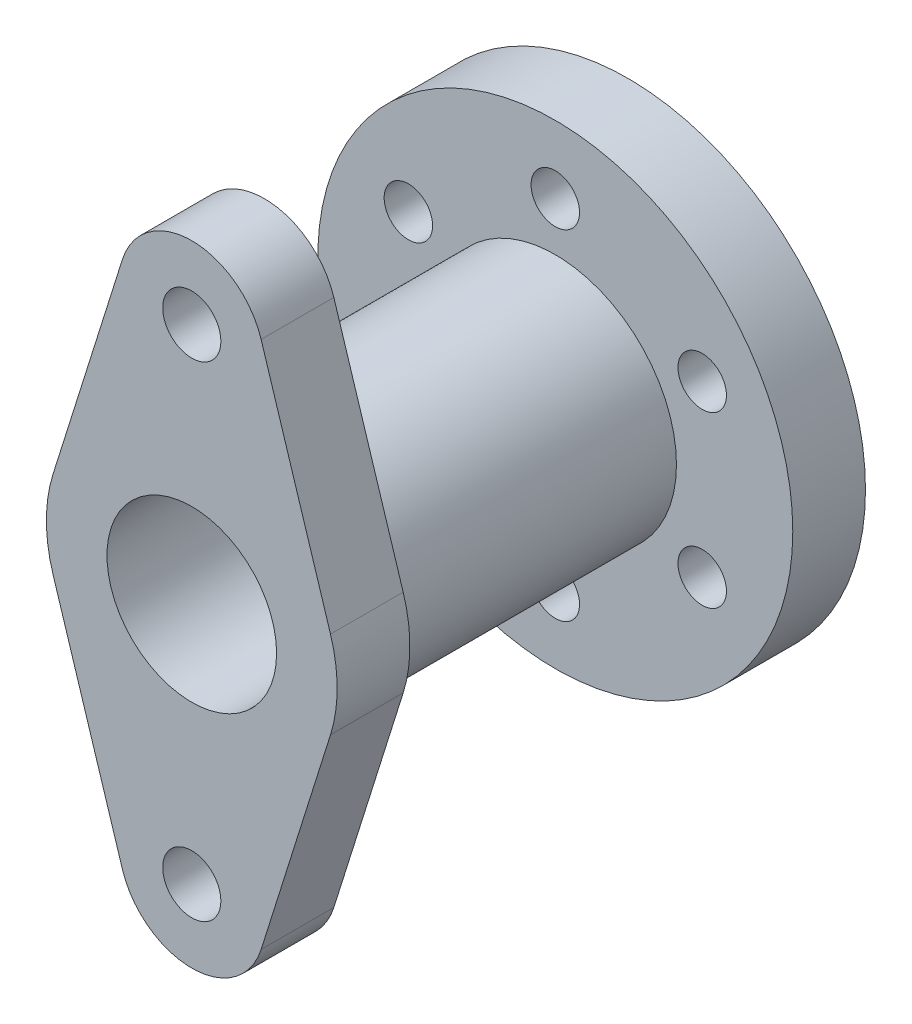
ISO-10303-21;
HEADER;
FILE_DESCRIPTION(('STEP AP214'),'2;1');
FILE_NAME('part.step','',(''),(''),'','','');
FILE_SCHEMA(('AUTOMOTIVE_DESIGN { 1 0 10303 214 1 1 1 1 }'));
ENDSEC;
DATA;
#1=APPLICATION_CONTEXT('core data for automotive mechanical design processes');
#2=APPLICATION_PROTOCOL_DEFINITION('international standard','automotive_design',2000,#1);
#3=PRODUCT_CONTEXT('',#1,'mechanical');
#4=PRODUCT('Part','Part','',(#3));
#5=PRODUCT_RELATED_PRODUCT_CATEGORY('part','',(#4));
#6=PRODUCT_DEFINITION_FORMATION('','',#4);
#7=PRODUCT_DEFINITION_CONTEXT('part definition',#1,'design');
#8=PRODUCT_DEFINITION('design','',#6,#7);
#9=PRODUCT_DEFINITION_SHAPE('','',#8);
#10=(LENGTH_UNIT() NAMED_UNIT(*) SI_UNIT(.MILLI.,.METRE.));
#11=(NAMED_UNIT(*) PLANE_ANGLE_UNIT() SI_UNIT($,.RADIAN.));
#12=(NAMED_UNIT(*) SI_UNIT($,.STERADIAN.) SOLID_ANGLE_UNIT());
#13=UNCERTAINTY_MEASURE_WITH_UNIT(LENGTH_MEASURE(1.E-05),#10,'distance_accuracy_value','');
#14=(GEOMETRIC_REPRESENTATION_CONTEXT(3) GLOBAL_UNCERTAINTY_ASSIGNED_CONTEXT((#13)) GLOBAL_UNIT_ASSIGNED_CONTEXT((#10,
#11,#12)) REPRESENTATION_CONTEXT('',''));
#15=CARTESIAN_POINT('',(0.,0.,0.));
#16=DIRECTION('',(0.,0.,1.));
#17=DIRECTION('',(1.,0.,0.));
#18=AXIS2_PLACEMENT_3D('',#15,#16,#17);
#19=CARTESIAN_POINT('',(0.,0.,90.));
#20=DIRECTION('',(0.,0.,-1.));
#21=DIRECTION('',(-1.,0.,0.));
#22=AXIS2_PLACEMENT_3D('',#19,#20,#21);
#23=CYLINDRICAL_SURFACE('',#22,25.);
#24=CARTESIAN_POINT('',(0.,0.,15.));
#25=DIRECTION('',(0.,0.,1.));
#26=DIRECTION('',(1.,0.,0.));
#27=AXIS2_PLACEMENT_3D('',#24,#25,#26);
#28=CIRCLE('',#27,25.);
#29=CARTESIAN_POINT('',(25.,0.,15.));
#30=VERTEX_POINT('',#29);
#31=EDGE_CURVE('E179',#30,#30,#28,.T.);
#32=ORIENTED_EDGE('',*,*,#31,.T.);
#33=EDGE_LOOP('',(#32));
#34=FACE_BOUND('',#33,.T.);
#35=CARTESIAN_POINT('',(0.,0.,75.));
#36=DIRECTION('',(0.,0.,1.));
#37=DIRECTION('',(1.,0.,0.));
#38=AXIS2_PLACEMENT_3D('',#35,#36,#37);
#39=CIRCLE('',#38,25.);
#40=CARTESIAN_POINT('',(25.,0.,75.));
#41=VERTEX_POINT('',#40);
#42=EDGE_CURVE('E13',#41,#41,#39,.T.);
#43=ORIENTED_EDGE('',*,*,#42,.F.);
#44=EDGE_LOOP('',(#43));
#45=FACE_BOUND('',#44,.T.);
#46=ADVANCED_FACE('F53',(#34,#45),#23,.T.);
#47=CARTESIAN_POINT('',(0.,0.,15.));
#48=DIRECTION('',(0.,0.,-1.));
#49=DIRECTION('',(-1.,0.,0.));
#50=AXIS2_PLACEMENT_3D('',#47,#48,#49);
#51=CYLINDRICAL_SURFACE('',#50,49.);
#52=CARTESIAN_POINT('',(0.,0.,15.));
#53=DIRECTION('',(0.,0.,1.));
#54=DIRECTION('',(1.,0.,0.));
#55=AXIS2_PLACEMENT_3D('',#52,#53,#54);
#56=CIRCLE('',#55,49.);
#57=CARTESIAN_POINT('',(49.,0.,15.));
#58=VERTEX_POINT('',#57);
#59=EDGE_CURVE('E228',#58,#58,#56,.T.);
#60=ORIENTED_EDGE('',*,*,#59,.F.);
#61=EDGE_LOOP('',(#60));
#62=FACE_BOUND('',#61,.T.);
#63=CARTESIAN_POINT('',(0.,0.,0.));
#64=DIRECTION('',(0.,0.,1.));
#65=DIRECTION('',(1.,0.,0.));
#66=AXIS2_PLACEMENT_3D('',#63,#64,#65);
#67=CIRCLE('',#66,49.);
#68=CARTESIAN_POINT('',(49.,0.,0.));
#69=VERTEX_POINT('',#68);
#70=EDGE_CURVE('E195',#69,#69,#67,.T.);
#71=ORIENTED_EDGE('',*,*,#70,.T.);
#72=EDGE_LOOP('',(#71));
#73=FACE_BOUND('',#72,.T.);
#74=ADVANCED_FACE('F55',(#62,#73),#51,.T.);
#75=CARTESIAN_POINT('',(0.,0.,15.));
#76=DIRECTION('',(0.,0.,1.));
#77=DIRECTION('',(1.,0.,0.));
#78=AXIS2_PLACEMENT_3D('',#75,#76,#77);
#79=PLANE('',#78);
#80=ORIENTED_EDGE('',*,*,#31,.F.);
#81=EDGE_LOOP('',(#80));
#82=FACE_BOUND('',#81,.T.);
#83=CARTESIAN_POINT('',(0.,35.,15.));
#84=DIRECTION('',(0.,0.,1.));
#85=DIRECTION('',(1.,0.,0.));
#86=AXIS2_PLACEMENT_3D('',#83,#84,#85);
#87=CIRCLE('',#86,5.);
#88=CARTESIAN_POINT('',(5.,35.,15.));
#89=VERTEX_POINT('',#88);
#90=EDGE_CURVE('E196',#89,#89,#87,.T.);
#91=ORIENTED_EDGE('',*,*,#90,.F.);
#92=EDGE_LOOP('',(#91));
#93=FACE_BOUND('',#92,.T.);
#94=CARTESIAN_POINT('',(-30.3108891324544,17.4999999999983,15.));
#95=DIRECTION('',(0.,0.,1.));
#96=DIRECTION('',(1.,0.,0.));
#97=AXIS2_PLACEMENT_3D('',#94,#95,#96);
#98=CIRCLE('',#97,5.00000000000187);
#99=CARTESIAN_POINT('',(-25.3108891324525,17.4999999999983,15.));
#100=VERTEX_POINT('',#99);
#101=EDGE_CURVE('E191',#100,#100,#98,.T.);
#102=ORIENTED_EDGE('',*,*,#101,.F.);
#103=EDGE_LOOP('',(#102));
#104=FACE_BOUND('',#103,.T.);
#105=CARTESIAN_POINT('',(-30.3108891324524,-17.5000000000017,15.));
#106=DIRECTION('',(0.,0.,1.));
#107=DIRECTION('',(1.,0.,0.));
#108=AXIS2_PLACEMENT_3D('',#105,#106,#107);
#109=CIRCLE('',#108,5.00000000000366);
#110=CARTESIAN_POINT('',(-25.3108891324487,-17.5000000000017,15.));
#111=VERTEX_POINT('',#110);
#112=EDGE_CURVE('E203',#111,#111,#109,.T.);
#113=ORIENTED_EDGE('',*,*,#112,.F.);
#114=EDGE_LOOP('',(#113));
#115=FACE_BOUND('',#114,.T.);
#116=CARTESIAN_POINT('',(3.97046679266253E-12,-35.,15.));
#117=DIRECTION('',(0.,0.,1.));
#118=DIRECTION('',(1.,0.,0.));
#119=AXIS2_PLACEMENT_3D('',#116,#117,#118);
#120=CIRCLE('',#119,5.00000000000403);
#121=CARTESIAN_POINT('',(5.000000000008,-35.,15.));
#122=VERTEX_POINT('',#121);
#123=EDGE_CURVE('E220',#122,#122,#120,.T.);
#124=ORIENTED_EDGE('',*,*,#123,.F.);
#125=EDGE_LOOP('',(#124));
#126=FACE_BOUND('',#125,.T.);
#127=CARTESIAN_POINT('',(30.3108891324583,-17.4999999999983,15.));
#128=DIRECTION('',(0.,0.,1.));
#129=DIRECTION('',(1.,0.,0.));
#130=AXIS2_PLACEMENT_3D('',#127,#128,#129);
#131=CIRCLE('',#130,5.00000000000251);
#132=CARTESIAN_POINT('',(35.3108891324608,-17.4999999999983,15.));
#133=VERTEX_POINT('',#132);
#134=EDGE_CURVE('E214',#133,#133,#131,.T.);
#135=ORIENTED_EDGE('',*,*,#134,.F.);
#136=EDGE_LOOP('',(#135));
#137=FACE_BOUND('',#136,.T.);
#138=CARTESIAN_POINT('',(30.3108891324563,17.5000000000017,15.));
#139=DIRECTION('',(0.,0.,1.));
#140=DIRECTION('',(1.,0.,0.));
#141=AXIS2_PLACEMENT_3D('',#138,#139,#140);
#142=CIRCLE('',#141,5.00000000000053);
#143=CARTESIAN_POINT('',(35.3108891324569,17.5000000000017,15.));
#144=VERTEX_POINT('',#143);
#145=EDGE_CURVE('E208',#144,#144,#142,.T.);
#146=ORIENTED_EDGE('',*,*,#145,.F.);
#147=EDGE_LOOP('',(#146));
#148=FACE_BOUND('',#147,.T.);
#149=ORIENTED_EDGE('',*,*,#59,.T.);
#150=EDGE_LOOP('',(#149));
#151=FACE_BOUND('',#150,.T.);
#152=ADVANCED_FACE('F241',(#82,#93,#104,#115,#126,#137,#148,#151),#79,.T.);
#153=CARTESIAN_POINT('',(0.,0.,0.));
#154=DIRECTION('',(0.,0.,1.));
#155=DIRECTION('',(1.,0.,0.));
#156=AXIS2_PLACEMENT_3D('',#153,#154,#155);
#157=PLANE('',#156);
#158=CARTESIAN_POINT('',(0.,35.,0.));
#159=DIRECTION('',(0.,0.,1.));
#160=DIRECTION('',(1.,0.,0.));
#161=AXIS2_PLACEMENT_3D('',#158,#159,#160);
#162=CIRCLE('',#161,5.);
#163=CARTESIAN_POINT('',(5.,35.,0.));
#164=VERTEX_POINT('',#163);
#165=EDGE_CURVE('E192',#164,#164,#162,.T.);
#166=ORIENTED_EDGE('',*,*,#165,.T.);
#167=EDGE_LOOP('',(#166));
#168=FACE_BOUND('',#167,.T.);
#169=CARTESIAN_POINT('',(-30.3108891324544,17.4999999999983,0.));
#170=DIRECTION('',(0.,0.,1.));
#171=DIRECTION('',(1.,0.,0.));
#172=AXIS2_PLACEMENT_3D('',#169,#170,#171);
#173=CIRCLE('',#172,5.00000000000187);
#174=CARTESIAN_POINT('',(-25.3108891324525,17.4999999999983,0.));
#175=VERTEX_POINT('',#174);
#176=EDGE_CURVE('E200',#175,#175,#173,.T.);
#177=ORIENTED_EDGE('',*,*,#176,.T.);
#178=EDGE_LOOP('',(#177));
#179=FACE_BOUND('',#178,.T.);
#180=CARTESIAN_POINT('',(-30.3108891324524,-17.5000000000017,0.));
#181=DIRECTION('',(0.,0.,1.));
#182=DIRECTION('',(1.,0.,0.));
#183=AXIS2_PLACEMENT_3D('',#180,#181,#182);
#184=CIRCLE('',#183,5.00000000000366);
#185=CARTESIAN_POINT('',(-25.3108891324487,-17.5000000000017,0.));
#186=VERTEX_POINT('',#185);
#187=EDGE_CURVE('E223',#186,#186,#184,.T.);
#188=ORIENTED_EDGE('',*,*,#187,.T.);
#189=EDGE_LOOP('',(#188));
#190=FACE_BOUND('',#189,.T.);
#191=CARTESIAN_POINT('',(3.97046679266253E-12,-35.,0.));
#192=DIRECTION('',(0.,0.,1.));
#193=DIRECTION('',(1.,0.,0.));
#194=AXIS2_PLACEMENT_3D('',#191,#192,#193);
#195=CIRCLE('',#194,5.00000000000403);
#196=CARTESIAN_POINT('',(5.000000000008,-35.,0.));
#197=VERTEX_POINT('',#196);
#198=EDGE_CURVE('E217',#197,#197,#195,.T.);
#199=ORIENTED_EDGE('',*,*,#198,.T.);
#200=EDGE_LOOP('',(#199));
#201=FACE_BOUND('',#200,.T.);
#202=CARTESIAN_POINT('',(30.3108891324583,-17.4999999999983,0.));
#203=DIRECTION('',(0.,0.,1.));
#204=DIRECTION('',(1.,0.,0.));
#205=AXIS2_PLACEMENT_3D('',#202,#203,#204);
#206=CIRCLE('',#205,5.00000000000251);
#207=CARTESIAN_POINT('',(35.3108891324608,-17.4999999999983,0.));
#208=VERTEX_POINT('',#207);
#209=EDGE_CURVE('E211',#208,#208,#206,.T.);
#210=ORIENTED_EDGE('',*,*,#209,.T.);
#211=EDGE_LOOP('',(#210));
#212=FACE_BOUND('',#211,.T.);
#213=CARTESIAN_POINT('',(30.3108891324563,17.5000000000017,0.));
#214=DIRECTION('',(0.,0.,1.));
#215=DIRECTION('',(1.,0.,0.));
#216=AXIS2_PLACEMENT_3D('',#213,#214,#215);
#217=CIRCLE('',#216,5.00000000000053);
#218=CARTESIAN_POINT('',(35.3108891324569,17.5000000000017,0.));
#219=VERTEX_POINT('',#218);
#220=EDGE_CURVE('E199',#219,#219,#217,.T.);
#221=ORIENTED_EDGE('',*,*,#220,.T.);
#222=EDGE_LOOP('',(#221));
#223=FACE_BOUND('',#222,.T.);
#224=ORIENTED_EDGE('',*,*,#70,.F.);
#225=EDGE_LOOP('',(#224));
#226=FACE_BOUND('',#225,.T.);
#227=ADVANCED_FACE('F249',(#168,#179,#190,#201,#212,#223,#226),#157,.F.);
#228=CARTESIAN_POINT('',(30.3108891324563,17.5000000000017,0.));
#229=DIRECTION('',(0.,0.,1.));
#230=DIRECTION('',(1.,0.,0.));
#231=AXIS2_PLACEMENT_3D('',#228,#229,#230);
#232=CYLINDRICAL_SURFACE('',#231,5.00000000000053);
#233=ORIENTED_EDGE('',*,*,#220,.F.);
#234=EDGE_LOOP('',(#233));
#235=FACE_BOUND('',#234,.T.);
#236=ORIENTED_EDGE('',*,*,#145,.T.);
#237=EDGE_LOOP('',(#236));
#238=FACE_BOUND('',#237,.T.);
#239=ADVANCED_FACE('F272',(#235,#238),#232,.F.);
#240=CARTESIAN_POINT('',(30.3108891324583,-17.4999999999983,0.));
#241=DIRECTION('',(0.,0.,1.));
#242=DIRECTION('',(1.,0.,0.));
#243=AXIS2_PLACEMENT_3D('',#240,#241,#242);
#244=CYLINDRICAL_SURFACE('',#243,5.00000000000251);
#245=ORIENTED_EDGE('',*,*,#209,.F.);
#246=EDGE_LOOP('',(#245));
#247=FACE_BOUND('',#246,.T.);
#248=ORIENTED_EDGE('',*,*,#134,.T.);
#249=EDGE_LOOP('',(#248));
#250=FACE_BOUND('',#249,.T.);
#251=ADVANCED_FACE('F275',(#247,#250),#244,.F.);
#252=CARTESIAN_POINT('',(3.97046679266253E-12,-35.,0.));
#253=DIRECTION('',(0.,0.,1.));
#254=DIRECTION('',(1.,0.,0.));
#255=AXIS2_PLACEMENT_3D('',#252,#253,#254);
#256=CYLINDRICAL_SURFACE('',#255,5.00000000000403);
#257=ORIENTED_EDGE('',*,*,#198,.F.);
#258=EDGE_LOOP('',(#257));
#259=FACE_BOUND('',#258,.T.);
#260=ORIENTED_EDGE('',*,*,#123,.T.);
#261=EDGE_LOOP('',(#260));
#262=FACE_BOUND('',#261,.T.);
#263=ADVANCED_FACE('F279',(#259,#262),#256,.F.);
#264=CARTESIAN_POINT('',(-30.3108891324524,-17.5000000000017,0.));
#265=DIRECTION('',(0.,0.,1.));
#266=DIRECTION('',(1.,0.,0.));
#267=AXIS2_PLACEMENT_3D('',#264,#265,#266);
#268=CYLINDRICAL_SURFACE('',#267,5.00000000000366);
#269=ORIENTED_EDGE('',*,*,#187,.F.);
#270=EDGE_LOOP('',(#269));
#271=FACE_BOUND('',#270,.T.);
#272=ORIENTED_EDGE('',*,*,#112,.T.);
#273=EDGE_LOOP('',(#272));
#274=FACE_BOUND('',#273,.T.);
#275=ADVANCED_FACE('F270',(#271,#274),#268,.F.);
#276=CARTESIAN_POINT('',(-30.3108891324544,17.4999999999983,0.));
#277=DIRECTION('',(0.,0.,1.));
#278=DIRECTION('',(1.,0.,0.));
#279=AXIS2_PLACEMENT_3D('',#276,#277,#278);
#280=CYLINDRICAL_SURFACE('',#279,5.00000000000187);
#281=ORIENTED_EDGE('',*,*,#176,.F.);
#282=EDGE_LOOP('',(#281));
#283=FACE_BOUND('',#282,.T.);
#284=ORIENTED_EDGE('',*,*,#101,.T.);
#285=EDGE_LOOP('',(#284));
#286=FACE_BOUND('',#285,.T.);
#287=ADVANCED_FACE('F266',(#283,#286),#280,.F.);
#288=CARTESIAN_POINT('',(0.,35.,0.));
#289=DIRECTION('',(0.,0.,1.));
#290=DIRECTION('',(1.,0.,0.));
#291=AXIS2_PLACEMENT_3D('',#288,#289,#290);
#292=CYLINDRICAL_SURFACE('',#291,5.);
#293=ORIENTED_EDGE('',*,*,#165,.F.);
#294=EDGE_LOOP('',(#293));
#295=FACE_BOUND('',#294,.T.);
#296=ORIENTED_EDGE('',*,*,#90,.T.);
#297=EDGE_LOOP('',(#296));
#298=FACE_BOUND('',#297,.T.);
#299=ADVANCED_FACE('F262',(#295,#298),#292,.F.);
#300=CARTESIAN_POINT('',(0.,50.,75.));
#301=DIRECTION('',(0.,0.,1.));
#302=DIRECTION('',(1.,0.,0.));
#303=AXIS2_PLACEMENT_3D('',#300,#301,#302);
#304=CYLINDRICAL_SURFACE('',#303,15.);
#305=CARTESIAN_POINT('',(0.,50.,90.));
#306=DIRECTION('',(0.,0.,1.));
#307=DIRECTION('',(1.,0.,0.));
#308=AXIS2_PLACEMENT_3D('',#305,#306,#307);
#309=CIRCLE('',#308,15.);
#310=CARTESIAN_POINT('',(14.3090880212542,54.5,90.));
#311=VERTEX_POINT('',#310);
#312=CARTESIAN_POINT('',(-14.3090880212542,54.5,90.));
#313=VERTEX_POINT('',#312);
#314=EDGE_CURVE('E155',#311,#313,#309,.T.);
#315=ORIENTED_EDGE('',*,*,#314,.F.);
#316=DIRECTION('',(0.,0.,1.));
#317=VECTOR('',#316,1.);
#318=CARTESIAN_POINT('',(14.3090880212542,54.5,75.));
#319=LINE('',#318,#317);
#320=CARTESIAN_POINT('',(14.3090880212542,54.5,75.));
#321=VERTEX_POINT('',#320);
#322=EDGE_CURVE('E72',#321,#311,#319,.T.);
#323=ORIENTED_EDGE('',*,*,#322,.F.);
#324=CARTESIAN_POINT('',(0.,50.,75.));
#325=DIRECTION('',(0.,0.,1.));
#326=DIRECTION('',(1.,0.,0.));
#327=AXIS2_PLACEMENT_3D('',#324,#325,#326);
#328=CIRCLE('',#327,15.);
#329=CARTESIAN_POINT('',(-14.3090880212542,54.5,75.));
#330=VERTEX_POINT('',#329);
#331=EDGE_CURVE('E177',#321,#330,#328,.T.);
#332=ORIENTED_EDGE('',*,*,#331,.T.);
#333=DIRECTION('',(0.,0.,1.));
#334=VECTOR('',#333,1.);
#335=CARTESIAN_POINT('',(-14.3090880212542,54.5,75.));
#336=LINE('',#335,#334);
#337=EDGE_CURVE('E113',#330,#313,#336,.T.);
#338=ORIENTED_EDGE('',*,*,#337,.T.);
#339=EDGE_LOOP('',(#315,#323,#332,#338));
#340=FACE_BOUND('',#339,.T.);
#341=ADVANCED_FACE('F265',(#340),#304,.T.);
#342=CARTESIAN_POINT('',(14.3090880212542,54.5,75.));
#343=DIRECTION('',(0.953939201416946,0.3,0.));
#344=DIRECTION('',(-0.3,0.953939201416946,0.));
#345=AXIS2_PLACEMENT_3D('',#342,#343,#344);
#346=PLANE('',#345);
#347=DIRECTION('',(-0.3,0.953939201416946,0.));
#348=VECTOR('',#347,1.);
#349=CARTESIAN_POINT('',(14.3090880212542,54.5,90.));
#350=LINE('',#349,#348);
#351=CARTESIAN_POINT('',(28.6181760425084,9.,90.));
#352=VERTEX_POINT('',#351);
#353=EDGE_CURVE('E174',#352,#311,#350,.T.);
#354=ORIENTED_EDGE('',*,*,#353,.F.);
#355=DIRECTION('',(0.,0.,1.));
#356=VECTOR('',#355,1.);
#357=CARTESIAN_POINT('',(28.6181760425084,9.,75.));
#358=LINE('',#357,#356);
#359=CARTESIAN_POINT('',(28.6181760425084,9.,75.));
#360=VERTEX_POINT('',#359);
#361=EDGE_CURVE('E101',#360,#352,#358,.T.);
#362=ORIENTED_EDGE('',*,*,#361,.F.);
#363=DIRECTION('',(-0.3,0.953939201416946,0.));
#364=VECTOR('',#363,1.);
#365=CARTESIAN_POINT('',(14.3090880212542,54.5,75.));
#366=LINE('',#365,#364);
#367=EDGE_CURVE('E145',#360,#321,#366,.T.);
#368=ORIENTED_EDGE('',*,*,#367,.T.);
#369=ORIENTED_EDGE('',*,*,#322,.T.);
#370=EDGE_LOOP('',(#354,#362,#368,#369));
#371=FACE_BOUND('',#370,.T.);
#372=ADVANCED_FACE('F379',(#371),#346,.T.);
#373=CARTESIAN_POINT('',(0.,0.,75.));
#374=DIRECTION('',(0.,0.,1.));
#375=DIRECTION('',(1.,0.,0.));
#376=AXIS2_PLACEMENT_3D('',#373,#374,#375);
#377=CYLINDRICAL_SURFACE('',#376,30.);
#378=CARTESIAN_POINT('',(0.,0.,90.));
#379=DIRECTION('',(0.,0.,1.));
#380=DIRECTION('',(1.,0.,0.));
#381=AXIS2_PLACEMENT_3D('',#378,#379,#380);
#382=CIRCLE('',#381,30.);
#383=CARTESIAN_POINT('',(28.6181760425084,-9.00000000000001,90.));
#384=VERTEX_POINT('',#383);
#385=EDGE_CURVE('E132',#384,#352,#382,.T.);
#386=ORIENTED_EDGE('',*,*,#385,.F.);
#387=DIRECTION('',(0.,0.,1.));
#388=VECTOR('',#387,1.);
#389=CARTESIAN_POINT('',(28.6181760425084,-9.00000000000001,75.));
#390=LINE('',#389,#388);
#391=CARTESIAN_POINT('',(28.6181760425084,-9.00000000000001,75.));
#392=VERTEX_POINT('',#391);
#393=EDGE_CURVE('E127',#392,#384,#390,.T.);
#394=ORIENTED_EDGE('',*,*,#393,.F.);
#395=CARTESIAN_POINT('',(0.,0.,75.));
#396=DIRECTION('',(0.,0.,1.));
#397=DIRECTION('',(1.,0.,0.));
#398=AXIS2_PLACEMENT_3D('',#395,#396,#397);
#399=CIRCLE('',#398,30.);
#400=EDGE_CURVE('E130',#392,#360,#399,.T.);
#401=ORIENTED_EDGE('',*,*,#400,.T.);
#402=ORIENTED_EDGE('',*,*,#361,.T.);
#403=EDGE_LOOP('',(#386,#394,#401,#402));
#404=FACE_BOUND('',#403,.T.);
#405=ADVANCED_FACE('F129',(#404),#377,.T.);
#406=CARTESIAN_POINT('',(14.3090880212542,-54.5,75.));
#407=DIRECTION('',(0.953939201416946,-0.3,0.));
#408=DIRECTION('',(0.3,0.953939201416946,0.));
#409=AXIS2_PLACEMENT_3D('',#406,#407,#408);
#410=PLANE('',#409);
#411=DIRECTION('',(0.3,0.953939201416946,0.));
#412=VECTOR('',#411,1.);
#413=CARTESIAN_POINT('',(14.3090880212542,-54.5,90.));
#414=LINE('',#413,#412);
#415=CARTESIAN_POINT('',(14.3090880212542,-54.5,90.));
#416=VERTEX_POINT('',#415);
#417=EDGE_CURVE('E171',#416,#384,#414,.T.);
#418=ORIENTED_EDGE('',*,*,#417,.F.);
#419=DIRECTION('',(0.,0.,1.));
#420=VECTOR('',#419,1.);
#421=CARTESIAN_POINT('',(14.3090880212542,-54.5,75.));
#422=LINE('',#421,#420);
#423=CARTESIAN_POINT('',(14.3090880212542,-54.5,75.));
#424=VERTEX_POINT('',#423);
#425=EDGE_CURVE('E137',#424,#416,#422,.T.);
#426=ORIENTED_EDGE('',*,*,#425,.F.);
#427=DIRECTION('',(0.3,0.953939201416946,0.));
#428=VECTOR('',#427,1.);
#429=CARTESIAN_POINT('',(14.3090880212542,-54.5,75.));
#430=LINE('',#429,#428);
#431=EDGE_CURVE('E143',#424,#392,#430,.T.);
#432=ORIENTED_EDGE('',*,*,#431,.T.);
#433=ORIENTED_EDGE('',*,*,#393,.T.);
#434=EDGE_LOOP('',(#418,#426,#432,#433));
#435=FACE_BOUND('',#434,.T.);
#436=ADVANCED_FACE('F147',(#435),#410,.T.);
#437=CARTESIAN_POINT('',(0.,-50.,75.));
#438=DIRECTION('',(0.,0.,1.));
#439=DIRECTION('',(1.,0.,0.));
#440=AXIS2_PLACEMENT_3D('',#437,#438,#439);
#441=CYLINDRICAL_SURFACE('',#440,15.);
#442=CARTESIAN_POINT('',(0.,-50.,90.));
#443=DIRECTION('',(0.,0.,1.));
#444=DIRECTION('',(1.,0.,0.));
#445=AXIS2_PLACEMENT_3D('',#442,#443,#444);
#446=CIRCLE('',#445,15.);
#447=CARTESIAN_POINT('',(-14.3090880212542,-54.5,90.));
#448=VERTEX_POINT('',#447);
#449=EDGE_CURVE('E168',#448,#416,#446,.T.);
#450=ORIENTED_EDGE('',*,*,#449,.F.);
#451=DIRECTION('',(0.,0.,1.));
#452=VECTOR('',#451,1.);
#453=CARTESIAN_POINT('',(-14.3090880212542,-54.5,75.));
#454=LINE('',#453,#452);
#455=CARTESIAN_POINT('',(-14.3090880212542,-54.5,75.));
#456=VERTEX_POINT('',#455);
#457=EDGE_CURVE('E182',#456,#448,#454,.T.);
#458=ORIENTED_EDGE('',*,*,#457,.F.);
#459=CARTESIAN_POINT('',(0.,-50.,75.));
#460=DIRECTION('',(0.,0.,1.));
#461=DIRECTION('',(1.,0.,0.));
#462=AXIS2_PLACEMENT_3D('',#459,#460,#461);
#463=CIRCLE('',#462,15.);
#464=EDGE_CURVE('E148',#456,#424,#463,.T.);
#465=ORIENTED_EDGE('',*,*,#464,.T.);
#466=ORIENTED_EDGE('',*,*,#425,.T.);
#467=EDGE_LOOP('',(#450,#458,#465,#466));
#468=FACE_BOUND('',#467,.T.);
#469=ADVANCED_FACE('F404',(#468),#441,.T.);
#470=CARTESIAN_POINT('',(-14.3090880212542,-54.5,75.));
#471=DIRECTION('',(-0.953939201416946,-0.3,0.));
#472=DIRECTION('',(0.3,-0.953939201416946,0.));
#473=AXIS2_PLACEMENT_3D('',#470,#471,#472);
#474=PLANE('',#473);
#475=DIRECTION('',(0.3,-0.953939201416946,0.));
#476=VECTOR('',#475,1.);
#477=CARTESIAN_POINT('',(-14.3090880212542,-54.5,90.));
#478=LINE('',#477,#476);
#479=CARTESIAN_POINT('',(-28.6181760425084,-9.,90.));
#480=VERTEX_POINT('',#479);
#481=EDGE_CURVE('E165',#480,#448,#478,.T.);
#482=ORIENTED_EDGE('',*,*,#481,.F.);
#483=DIRECTION('',(0.,0.,1.));
#484=VECTOR('',#483,1.);
#485=CARTESIAN_POINT('',(-28.6181760425084,-9.,75.));
#486=LINE('',#485,#484);
#487=CARTESIAN_POINT('',(-28.6181760425084,-9.,75.));
#488=VERTEX_POINT('',#487);
#489=EDGE_CURVE('E184',#488,#480,#486,.T.);
#490=ORIENTED_EDGE('',*,*,#489,.F.);
#491=DIRECTION('',(0.3,-0.953939201416946,0.));
#492=VECTOR('',#491,1.);
#493=CARTESIAN_POINT('',(-14.3090880212542,-54.5,75.));
#494=LINE('',#493,#492);
#495=EDGE_CURVE('E150',#488,#456,#494,.T.);
#496=ORIENTED_EDGE('',*,*,#495,.T.);
#497=ORIENTED_EDGE('',*,*,#457,.T.);
#498=EDGE_LOOP('',(#482,#490,#496,#497));
#499=FACE_BOUND('',#498,.T.);
#500=ADVANCED_FACE('F413',(#499),#474,.T.);
#501=CARTESIAN_POINT('',(0.,0.,75.));
#502=DIRECTION('',(0.,0.,1.));
#503=DIRECTION('',(1.,0.,0.));
#504=AXIS2_PLACEMENT_3D('',#501,#502,#503);
#505=CYLINDRICAL_SURFACE('',#504,30.);
#506=CARTESIAN_POINT('',(0.,0.,90.));
#507=DIRECTION('',(0.,0.,1.));
#508=DIRECTION('',(1.,0.,0.));
#509=AXIS2_PLACEMENT_3D('',#506,#507,#508);
#510=CIRCLE('',#509,30.);
#511=CARTESIAN_POINT('',(-28.6181760425084,8.99999999999999,90.));
#512=VERTEX_POINT('',#511);
#513=EDGE_CURVE('E162',#512,#480,#510,.T.);
#514=ORIENTED_EDGE('',*,*,#513,.F.);
#515=DIRECTION('',(0.,0.,1.));
#516=VECTOR('',#515,1.);
#517=CARTESIAN_POINT('',(-28.6181760425084,8.99999999999999,75.));
#518=LINE('',#517,#516);
#519=CARTESIAN_POINT('',(-28.6181760425084,8.99999999999999,75.));
#520=VERTEX_POINT('',#519);
#521=EDGE_CURVE('E186',#520,#512,#518,.T.);
#522=ORIENTED_EDGE('',*,*,#521,.F.);
#523=CARTESIAN_POINT('',(0.,0.,75.));
#524=DIRECTION('',(0.,0.,1.));
#525=DIRECTION('',(1.,0.,0.));
#526=AXIS2_PLACEMENT_3D('',#523,#524,#525);
#527=CIRCLE('',#526,30.);
#528=EDGE_CURVE('E533',#520,#488,#527,.T.);
#529=ORIENTED_EDGE('',*,*,#528,.T.);
#530=ORIENTED_EDGE('',*,*,#489,.T.);
#531=EDGE_LOOP('',(#514,#522,#529,#530));
#532=FACE_BOUND('',#531,.T.);
#533=ADVANCED_FACE('F423',(#532),#505,.T.);
#534=CARTESIAN_POINT('',(-14.3090880212542,54.5,75.));
#535=DIRECTION('',(-0.953939201416946,0.3,0.));
#536=DIRECTION('',(-0.3,-0.953939201416946,0.));
#537=AXIS2_PLACEMENT_3D('',#534,#535,#536);
#538=PLANE('',#537);
#539=DIRECTION('',(-0.3,-0.953939201416946,0.));
#540=VECTOR('',#539,1.);
#541=CARTESIAN_POINT('',(-14.3090880212542,54.5,90.));
#542=LINE('',#541,#540);
#543=EDGE_CURVE('E158',#313,#512,#542,.T.);
#544=ORIENTED_EDGE('',*,*,#543,.F.);
#545=ORIENTED_EDGE('',*,*,#337,.F.);
#546=DIRECTION('',(-0.3,-0.953939201416946,0.));
#547=VECTOR('',#546,1.);
#548=CARTESIAN_POINT('',(-14.3090880212542,54.5,75.));
#549=LINE('',#548,#547);
#550=EDGE_CURVE('E531',#330,#520,#549,.T.);
#551=ORIENTED_EDGE('',*,*,#550,.T.);
#552=ORIENTED_EDGE('',*,*,#521,.T.);
#553=EDGE_LOOP('',(#544,#545,#551,#552));
#554=FACE_BOUND('',#553,.T.);
#555=ADVANCED_FACE('F433',(#554),#538,.T.);
#556=CARTESIAN_POINT('',(0.,50.,75.));
#557=DIRECTION('',(0.,0.,1.));
#558=DIRECTION('',(1.,0.,0.));
#559=AXIS2_PLACEMENT_3D('',#556,#557,#558);
#560=PLANE('',#559);
#561=ORIENTED_EDGE('',*,*,#42,.T.);
#562=EDGE_LOOP('',(#561));
#563=FACE_BOUND('',#562,.T.);
#564=CARTESIAN_POINT('',(0.,-50.,75.));
#565=DIRECTION('',(0.,0.,1.));
#566=DIRECTION('',(1.,0.,0.));
#567=AXIS2_PLACEMENT_3D('',#564,#565,#566);
#568=CIRCLE('',#567,6.);
#569=CARTESIAN_POINT('',(6.00000000000001,-50.,75.));
#570=VERTEX_POINT('',#569);
#571=EDGE_CURVE('E520',#570,#570,#568,.T.);
#572=ORIENTED_EDGE('',*,*,#571,.T.);
#573=EDGE_LOOP('',(#572));
#574=FACE_BOUND('',#573,.T.);
#575=CARTESIAN_POINT('',(0.,50.,75.));
#576=DIRECTION('',(0.,0.,1.));
#577=DIRECTION('',(1.,0.,0.));
#578=AXIS2_PLACEMENT_3D('',#575,#576,#577);
#579=CIRCLE('',#578,6.);
#580=CARTESIAN_POINT('',(6.,50.,75.));
#581=VERTEX_POINT('',#580);
#582=EDGE_CURVE('E159',#581,#581,#579,.T.);
#583=ORIENTED_EDGE('',*,*,#582,.T.);
#584=EDGE_LOOP('',(#583));
#585=FACE_BOUND('',#584,.T.);
#586=ORIENTED_EDGE('',*,*,#331,.F.);
#587=ORIENTED_EDGE('',*,*,#367,.F.);
#588=ORIENTED_EDGE('',*,*,#400,.F.);
#589=ORIENTED_EDGE('',*,*,#431,.F.);
#590=ORIENTED_EDGE('',*,*,#464,.F.);
#591=ORIENTED_EDGE('',*,*,#495,.F.);
#592=ORIENTED_EDGE('',*,*,#528,.F.);
#593=ORIENTED_EDGE('',*,*,#550,.F.);
#594=EDGE_LOOP('',(#586,#587,#588,#589,#590,#591,#592,#593));
#595=FACE_BOUND('',#594,.T.);
#596=ADVANCED_FACE('F141',(#563,#574,#585,#595),#560,.F.);
#597=CARTESIAN_POINT('',(0.,50.,75.));
#598=DIRECTION('',(0.,0.,1.));
#599=DIRECTION('',(1.,0.,0.));
#600=AXIS2_PLACEMENT_3D('',#597,#598,#599);
#601=CYLINDRICAL_SURFACE('',#600,6.);
#602=ORIENTED_EDGE('',*,*,#582,.F.);
#603=EDGE_LOOP('',(#602));
#604=FACE_BOUND('',#603,.T.);
#605=CARTESIAN_POINT('',(0.,50.,90.));
#606=DIRECTION('',(0.,0.,1.));
#607=DIRECTION('',(1.,0.,0.));
#608=AXIS2_PLACEMENT_3D('',#605,#606,#607);
#609=CIRCLE('',#608,6.);
#610=CARTESIAN_POINT('',(6.,50.,90.));
#611=VERTEX_POINT('',#610);
#612=EDGE_CURVE('E523',#611,#611,#609,.T.);
#613=ORIENTED_EDGE('',*,*,#612,.T.);
#614=EDGE_LOOP('',(#613));
#615=FACE_BOUND('',#614,.T.);
#616=ADVANCED_FACE('F451',(#604,#615),#601,.F.);
#617=CARTESIAN_POINT('',(0.,-50.,75.));
#618=DIRECTION('',(0.,0.,1.));
#619=DIRECTION('',(1.,0.,0.));
#620=AXIS2_PLACEMENT_3D('',#617,#618,#619);
#621=CYLINDRICAL_SURFACE('',#620,6.);
#622=ORIENTED_EDGE('',*,*,#571,.F.);
#623=EDGE_LOOP('',(#622));
#624=FACE_BOUND('',#623,.T.);
#625=CARTESIAN_POINT('',(0.,-50.,90.));
#626=DIRECTION('',(0.,0.,1.));
#627=DIRECTION('',(1.,0.,0.));
#628=AXIS2_PLACEMENT_3D('',#625,#626,#627);
#629=CIRCLE('',#628,6.);
#630=CARTESIAN_POINT('',(6.00000000000001,-50.,90.));
#631=VERTEX_POINT('',#630);
#632=EDGE_CURVE('E516',#631,#631,#629,.T.);
#633=ORIENTED_EDGE('',*,*,#632,.T.);
#634=EDGE_LOOP('',(#633));
#635=FACE_BOUND('',#634,.T.);
#636=ADVANCED_FACE('F461',(#624,#635),#621,.F.);
#637=CARTESIAN_POINT('',(0.,0.,90.));
#638=DIRECTION('',(0.,0.,1.));
#639=DIRECTION('',(1.,0.,0.));
#640=AXIS2_PLACEMENT_3D('',#637,#638,#639);
#641=PLANE('',#640);
#642=CARTESIAN_POINT('',(0.,0.,90.));
#643=DIRECTION('',(0.,0.,1.));
#644=DIRECTION('',(1.,0.,0.));
#645=AXIS2_PLACEMENT_3D('',#642,#643,#644);
#646=CIRCLE('',#645,17.5);
#647=CARTESIAN_POINT('',(17.5,0.,90.));
#648=VERTEX_POINT('',#647);
#649=EDGE_CURVE('E514',#648,#648,#646,.T.);
#650=ORIENTED_EDGE('',*,*,#649,.F.);
#651=EDGE_LOOP('',(#650));
#652=FACE_BOUND('',#651,.T.);
#653=ORIENTED_EDGE('',*,*,#632,.F.);
#654=EDGE_LOOP('',(#653));
#655=FACE_BOUND('',#654,.T.);
#656=ORIENTED_EDGE('',*,*,#612,.F.);
#657=EDGE_LOOP('',(#656));
#658=FACE_BOUND('',#657,.T.);
#659=ORIENTED_EDGE('',*,*,#314,.T.);
#660=ORIENTED_EDGE('',*,*,#543,.T.);
#661=ORIENTED_EDGE('',*,*,#513,.T.);
#662=ORIENTED_EDGE('',*,*,#481,.T.);
#663=ORIENTED_EDGE('',*,*,#449,.T.);
#664=ORIENTED_EDGE('',*,*,#417,.T.);
#665=ORIENTED_EDGE('',*,*,#385,.T.);
#666=ORIENTED_EDGE('',*,*,#353,.T.);
#667=EDGE_LOOP('',(#659,#660,#661,#662,#663,#664,#665,#666));
#668=FACE_BOUND('',#667,.T.);
#669=ADVANCED_FACE('F261',(#652,#655,#658,#668),#641,.T.);
#670=CARTESIAN_POINT('',(0.,0.,60.));
#671=DIRECTION('',(0.,0.,1.));
#672=DIRECTION('',(1.,0.,0.));
#673=AXIS2_PLACEMENT_3D('',#670,#671,#672);
#674=CYLINDRICAL_SURFACE('',#673,17.5);
#675=CARTESIAN_POINT('',(0.,0.,60.));
#676=DIRECTION('',(0.,0.,1.));
#677=DIRECTION('',(1.,0.,0.));
#678=AXIS2_PLACEMENT_3D('',#675,#676,#677);
#679=CIRCLE('',#678,17.5);
#680=CARTESIAN_POINT('',(17.5,0.,60.));
#681=VERTEX_POINT('',#680);
#682=EDGE_CURVE('E513',#681,#681,#679,.T.);
#683=ORIENTED_EDGE('',*,*,#682,.F.);
#684=EDGE_LOOP('',(#683));
#685=FACE_BOUND('',#684,.T.);
#686=ORIENTED_EDGE('',*,*,#649,.T.);
#687=EDGE_LOOP('',(#686));
#688=FACE_BOUND('',#687,.T.);
#689=ADVANCED_FACE('F480',(#685,#688),#674,.F.);
#690=CARTESIAN_POINT('',(0.,0.,60.));
#691=DIRECTION('',(0.,0.,1.));
#692=DIRECTION('',(1.,0.,0.));
#693=AXIS2_PLACEMENT_3D('',#690,#691,#692);
#694=PLANE('',#693);
#695=CARTESIAN_POINT('',(0.,0.,60.));
#696=DIRECTION('',(0.,0.,1.));
#697=DIRECTION('',(1.,0.,0.));
#698=AXIS2_PLACEMENT_3D('',#695,#696,#697);
#699=CIRCLE('',#698,13.);
#700=CARTESIAN_POINT('',(13.,0.,60.));
#701=VERTEX_POINT('',#700);
#702=EDGE_CURVE('E57',#701,#701,#699,.T.);
#703=ORIENTED_EDGE('',*,*,#702,.F.);
#704=EDGE_LOOP('',(#703));
#705=FACE_BOUND('',#704,.T.);
#706=ORIENTED_EDGE('',*,*,#682,.T.);
#707=EDGE_LOOP('',(#706));
#708=FACE_BOUND('',#707,.T.);
#709=ADVANCED_FACE('F245',(#705,#708),#694,.T.);
#710=CARTESIAN_POINT('',(0.,0.,90.));
#711=DIRECTION('',(0.,0.,-1.));
#712=DIRECTION('',(-1.,0.,0.));
#713=AXIS2_PLACEMENT_3D('',#710,#711,#712);
#714=CYLINDRICAL_SURFACE('',#713,13.);
#715=CARTESIAN_POINT('',(0.,0.,15.));
#716=DIRECTION('',(0.,0.,1.));
#717=DIRECTION('',(1.,0.,0.));
#718=AXIS2_PLACEMENT_3D('',#715,#716,#717);
#719=CIRCLE('',#718,13.);
#720=CARTESIAN_POINT('',(13.,0.,15.));
#721=VERTEX_POINT('',#720);
#722=EDGE_CURVE('E63',#721,#721,#719,.F.);
#723=ORIENTED_EDGE('',*,*,#722,.T.);
#724=EDGE_LOOP('',(#723));
#725=FACE_BOUND('',#724,.T.);
#726=ORIENTED_EDGE('',*,*,#702,.T.);
#727=EDGE_LOOP('',(#726));
#728=FACE_BOUND('',#727,.T.);
#729=ADVANCED_FACE('F235',(#725,#728),#714,.F.);
#730=ORIENTED_EDGE('',*,*,#722,.F.);
#731=EDGE_LOOP('',(#730));
#732=FACE_BOUND('',#731,.T.);
#733=ADVANCED_FACE('F238',(#732),#79,.T.);
#734=CLOSED_SHELL('',(#46,#74,#152,#227,#239,#251,#263,#275,#287,#299,#341,#372,#405,#436,#469,
#500,#533,#555,#596,#616,#636,#669,#689,#709,#729,#733));
#735=MANIFOLD_SOLID_BREP('B2',#734);
#736=ADVANCED_BREP_SHAPE_REPRESENTATION('',(#18,#735),#14);
#737=SHAPE_DEFINITION_REPRESENTATION(#9,#736);
ENDSEC;
END-ISO-10303-21;
